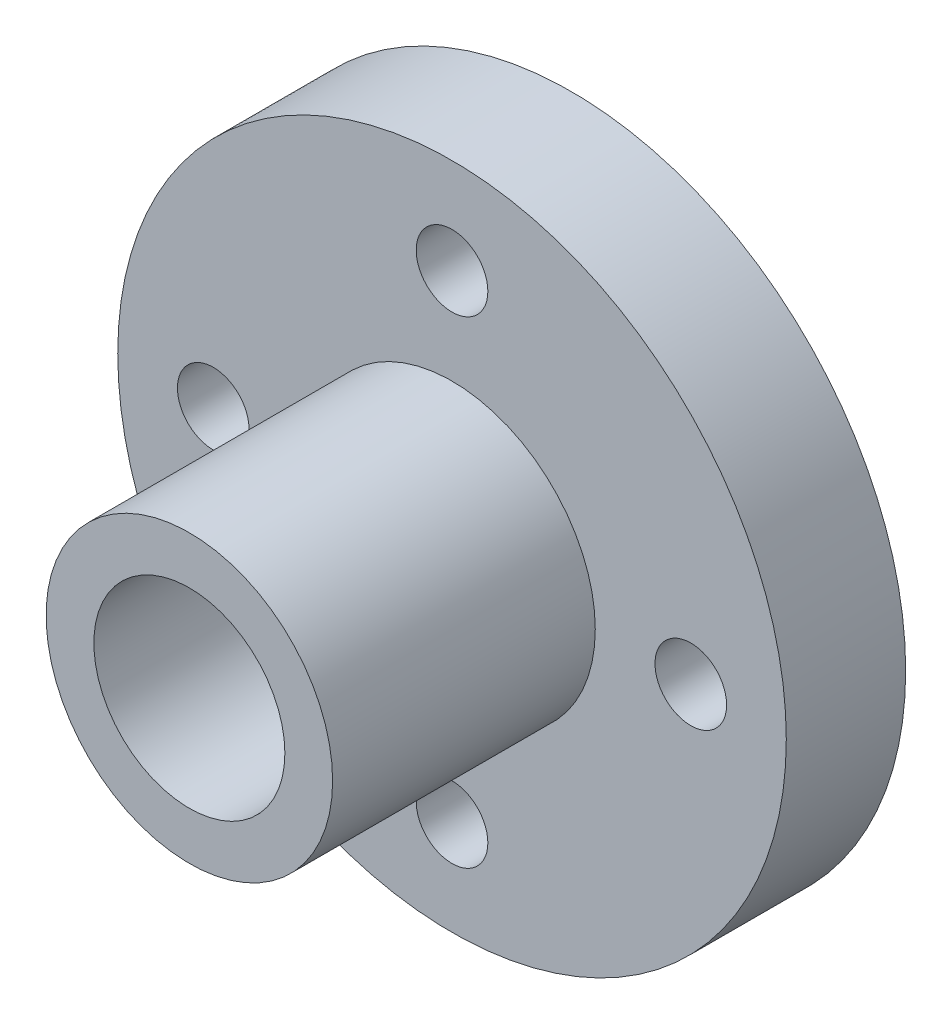
ISO-10303-21;
HEADER;
FILE_DESCRIPTION(('STEP AP214'),'2;1');
FILE_NAME('part.step','',(''),(''),'','','');
FILE_SCHEMA(('AUTOMOTIVE_DESIGN { 1 0 10303 214 1 1 1 1 }'));
ENDSEC;
DATA;
#1=APPLICATION_CONTEXT('core data for automotive mechanical design processes');
#2=APPLICATION_PROTOCOL_DEFINITION('international standard','automotive_design',2000,#1);
#3=PRODUCT_CONTEXT('',#1,'mechanical');
#4=PRODUCT('Part','Part','',(#3));
#5=PRODUCT_RELATED_PRODUCT_CATEGORY('part','',(#4));
#6=PRODUCT_DEFINITION_FORMATION('','',#4);
#7=PRODUCT_DEFINITION_CONTEXT('part definition',#1,'design');
#8=PRODUCT_DEFINITION('design','',#6,#7);
#9=PRODUCT_DEFINITION_SHAPE('','',#8);
#10=(LENGTH_UNIT() NAMED_UNIT(*) SI_UNIT(.MILLI.,.METRE.));
#11=(NAMED_UNIT(*) PLANE_ANGLE_UNIT() SI_UNIT($,.RADIAN.));
#12=(NAMED_UNIT(*) SI_UNIT($,.STERADIAN.) SOLID_ANGLE_UNIT());
#13=UNCERTAINTY_MEASURE_WITH_UNIT(LENGTH_MEASURE(1.E-05),#10,'distance_accuracy_value','');
#14=(GEOMETRIC_REPRESENTATION_CONTEXT(3) GLOBAL_UNCERTAINTY_ASSIGNED_CONTEXT((#13)) GLOBAL_UNIT_ASSIGNED_CONTEXT((#10,
#11,#12)) REPRESENTATION_CONTEXT('',''));
#15=CARTESIAN_POINT('',(0.,0.,0.));
#16=DIRECTION('',(0.,0.,1.));
#17=DIRECTION('',(1.,0.,0.));
#18=AXIS2_PLACEMENT_3D('',#15,#16,#17);
#19=CARTESIAN_POINT('',(0.,0.,5.));
#20=DIRECTION('',(0.,0.,1.));
#21=DIRECTION('',(1.,0.,0.));
#22=AXIS2_PLACEMENT_3D('',#19,#20,#21);
#23=PLANE('',#22);
#24=CARTESIAN_POINT('',(-10.,0.,5.));
#25=DIRECTION('',(0.,0.,1.));
#26=DIRECTION('',(1.,0.,0.));
#27=AXIS2_PLACEMENT_3D('',#24,#25,#26);
#28=CIRCLE('',#27,1.5);
#29=CARTESIAN_POINT('',(-8.5,0.,5.));
#30=VERTEX_POINT('',#29);
#31=EDGE_CURVE('E82',#30,#30,#28,.T.);
#32=ORIENTED_EDGE('',*,*,#31,.F.);
#33=EDGE_LOOP('',(#32));
#34=FACE_BOUND('',#33,.T.);
#35=CARTESIAN_POINT('',(10.,0.,5.));
#36=DIRECTION('',(0.,0.,1.));
#37=DIRECTION('',(1.,0.,0.));
#38=AXIS2_PLACEMENT_3D('',#35,#36,#37);
#39=CIRCLE('',#38,1.5);
#40=CARTESIAN_POINT('',(11.5,0.,5.));
#41=VERTEX_POINT('',#40);
#42=EDGE_CURVE('E66',#41,#41,#39,.T.);
#43=ORIENTED_EDGE('',*,*,#42,.F.);
#44=EDGE_LOOP('',(#43));
#45=FACE_BOUND('',#44,.T.);
#46=CARTESIAN_POINT('',(0.,0.,5.));
#47=DIRECTION('',(0.,0.,1.));
#48=DIRECTION('',(1.,0.,0.));
#49=AXIS2_PLACEMENT_3D('',#46,#47,#48);
#50=CIRCLE('',#49,14.);
#51=CARTESIAN_POINT('',(14.,0.,5.));
#52=VERTEX_POINT('',#51);
#53=EDGE_CURVE('E10',#52,#52,#50,.T.);
#54=ORIENTED_EDGE('',*,*,#53,.T.);
#55=EDGE_LOOP('',(#54));
#56=FACE_BOUND('',#55,.T.);
#57=CARTESIAN_POINT('',(0.,10.,5.));
#58=DIRECTION('',(0.,0.,1.));
#59=DIRECTION('',(1.,0.,0.));
#60=AXIS2_PLACEMENT_3D('',#57,#58,#59);
#61=CIRCLE('',#60,1.5);
#62=CARTESIAN_POINT('',(1.5,10.,5.));
#63=VERTEX_POINT('',#62);
#64=EDGE_CURVE('E61',#63,#63,#61,.T.);
#65=ORIENTED_EDGE('',*,*,#64,.F.);
#66=EDGE_LOOP('',(#65));
#67=FACE_BOUND('',#66,.T.);
#68=CARTESIAN_POINT('',(0.,-10.,5.));
#69=DIRECTION('',(0.,0.,1.));
#70=DIRECTION('',(1.,0.,0.));
#71=AXIS2_PLACEMENT_3D('',#68,#69,#70);
#72=CIRCLE('',#71,1.5);
#73=CARTESIAN_POINT('',(1.5,-10.,5.));
#74=VERTEX_POINT('',#73);
#75=EDGE_CURVE('E74',#74,#74,#72,.T.);
#76=ORIENTED_EDGE('',*,*,#75,.F.);
#77=EDGE_LOOP('',(#76));
#78=FACE_BOUND('',#77,.T.);
#79=CARTESIAN_POINT('',(0.,0.,5.));
#80=DIRECTION('',(0.,0.,1.));
#81=DIRECTION('',(1.,0.,0.));
#82=AXIS2_PLACEMENT_3D('',#79,#80,#81);
#83=CIRCLE('',#82,6.);
#84=CARTESIAN_POINT('',(6.,0.,5.));
#85=VERTEX_POINT('',#84);
#86=EDGE_CURVE('E94',#85,#85,#83,.T.);
#87=ORIENTED_EDGE('',*,*,#86,.F.);
#88=EDGE_LOOP('',(#87));
#89=FACE_BOUND('',#88,.T.);
#90=ADVANCED_FACE('F43',(#34,#45,#56,#67,#78,#89),#23,.T.);
#91=CARTESIAN_POINT('',(0.,0.,0.));
#92=DIRECTION('',(0.,0.,1.));
#93=DIRECTION('',(1.,0.,0.));
#94=AXIS2_PLACEMENT_3D('',#91,#92,#93);
#95=PLANE('',#94);
#96=CARTESIAN_POINT('',(0.,0.,0.));
#97=DIRECTION('',(0.,0.,1.));
#98=DIRECTION('',(1.,0.,0.));
#99=AXIS2_PLACEMENT_3D('',#96,#97,#98);
#100=CIRCLE('',#99,14.);
#101=CARTESIAN_POINT('',(14.,0.,0.));
#102=VERTEX_POINT('',#101);
#103=EDGE_CURVE('E47',#102,#102,#100,.T.);
#104=ORIENTED_EDGE('',*,*,#103,.F.);
#105=EDGE_LOOP('',(#104));
#106=FACE_BOUND('',#105,.T.);
#107=CARTESIAN_POINT('',(0.,0.,0.));
#108=DIRECTION('',(0.,0.,1.));
#109=DIRECTION('',(1.,0.,0.));
#110=AXIS2_PLACEMENT_3D('',#107,#108,#109);
#111=CIRCLE('',#110,4.);
#112=CARTESIAN_POINT('',(4.,0.,0.));
#113=VERTEX_POINT('',#112);
#114=EDGE_CURVE('E56',#113,#113,#111,.T.);
#115=ORIENTED_EDGE('',*,*,#114,.T.);
#116=EDGE_LOOP('',(#115));
#117=FACE_BOUND('',#116,.T.);
#118=CARTESIAN_POINT('',(0.,10.,0.));
#119=DIRECTION('',(0.,0.,1.));
#120=DIRECTION('',(1.,0.,0.));
#121=AXIS2_PLACEMENT_3D('',#118,#119,#120);
#122=CIRCLE('',#121,1.5);
#123=CARTESIAN_POINT('',(1.5,10.,0.));
#124=VERTEX_POINT('',#123);
#125=EDGE_CURVE('E62',#124,#124,#122,.T.);
#126=ORIENTED_EDGE('',*,*,#125,.T.);
#127=EDGE_LOOP('',(#126));
#128=FACE_BOUND('',#127,.T.);
#129=CARTESIAN_POINT('',(10.,0.,0.));
#130=DIRECTION('',(0.,0.,1.));
#131=DIRECTION('',(1.,0.,0.));
#132=AXIS2_PLACEMENT_3D('',#129,#130,#131);
#133=CIRCLE('',#132,1.5);
#134=CARTESIAN_POINT('',(11.5,0.,0.));
#135=VERTEX_POINT('',#134);
#136=EDGE_CURVE('E70',#135,#135,#133,.T.);
#137=ORIENTED_EDGE('',*,*,#136,.T.);
#138=EDGE_LOOP('',(#137));
#139=FACE_BOUND('',#138,.T.);
#140=CARTESIAN_POINT('',(0.,-10.,0.));
#141=DIRECTION('',(0.,0.,1.));
#142=DIRECTION('',(1.,0.,0.));
#143=AXIS2_PLACEMENT_3D('',#140,#141,#142);
#144=CIRCLE('',#143,1.5);
#145=CARTESIAN_POINT('',(1.5,-10.,0.));
#146=VERTEX_POINT('',#145);
#147=EDGE_CURVE('E78',#146,#146,#144,.T.);
#148=ORIENTED_EDGE('',*,*,#147,.T.);
#149=EDGE_LOOP('',(#148));
#150=FACE_BOUND('',#149,.T.);
#151=CARTESIAN_POINT('',(-10.,0.,0.));
#152=DIRECTION('',(0.,0.,1.));
#153=DIRECTION('',(1.,0.,0.));
#154=AXIS2_PLACEMENT_3D('',#151,#152,#153);
#155=CIRCLE('',#154,1.5);
#156=CARTESIAN_POINT('',(-8.5,0.,0.));
#157=VERTEX_POINT('',#156);
#158=EDGE_CURVE('E86',#157,#157,#155,.T.);
#159=ORIENTED_EDGE('',*,*,#158,.T.);
#160=EDGE_LOOP('',(#159));
#161=FACE_BOUND('',#160,.T.);
#162=ADVANCED_FACE('F125',(#106,#117,#128,#139,#150,#161),#95,.F.);
#163=CARTESIAN_POINT('',(0.,0.,5.));
#164=DIRECTION('',(0.,0.,-1.));
#165=DIRECTION('',(-1.,0.,0.));
#166=AXIS2_PLACEMENT_3D('',#163,#164,#165);
#167=CYLINDRICAL_SURFACE('',#166,14.);
#168=ORIENTED_EDGE('',*,*,#53,.F.);
#169=EDGE_LOOP('',(#168));
#170=FACE_BOUND('',#169,.T.);
#171=ORIENTED_EDGE('',*,*,#103,.T.);
#172=EDGE_LOOP('',(#171));
#173=FACE_BOUND('',#172,.T.);
#174=ADVANCED_FACE('F45',(#170,#173),#167,.T.);
#175=CARTESIAN_POINT('',(0.,0.,5.));
#176=DIRECTION('',(0.,0.,-1.));
#177=DIRECTION('',(-1.,0.,0.));
#178=AXIS2_PLACEMENT_3D('',#175,#176,#177);
#179=CYLINDRICAL_SURFACE('',#178,4.);
#180=ORIENTED_EDGE('',*,*,#114,.F.);
#181=EDGE_LOOP('',(#180));
#182=FACE_BOUND('',#181,.T.);
#183=CARTESIAN_POINT('',(0.,0.,16.));
#184=DIRECTION('',(0.,0.,1.));
#185=DIRECTION('',(1.,0.,0.));
#186=AXIS2_PLACEMENT_3D('',#183,#184,#185);
#187=CIRCLE('',#186,4.);
#188=CARTESIAN_POINT('',(4.,0.,16.));
#189=VERTEX_POINT('',#188);
#190=EDGE_CURVE('E98',#189,#189,#187,.T.);
#191=ORIENTED_EDGE('',*,*,#190,.T.);
#192=EDGE_LOOP('',(#191));
#193=FACE_BOUND('',#192,.T.);
#194=ADVANCED_FACE('F106',(#182,#193),#179,.F.);
#195=CARTESIAN_POINT('',(0.,10.,5.));
#196=DIRECTION('',(0.,0.,-1.));
#197=DIRECTION('',(-1.,0.,0.));
#198=AXIS2_PLACEMENT_3D('',#195,#196,#197);
#199=CYLINDRICAL_SURFACE('',#198,1.5);
#200=ORIENTED_EDGE('',*,*,#64,.T.);
#201=EDGE_LOOP('',(#200));
#202=FACE_BOUND('',#201,.T.);
#203=ORIENTED_EDGE('',*,*,#125,.F.);
#204=EDGE_LOOP('',(#203));
#205=FACE_BOUND('',#204,.T.);
#206=ADVANCED_FACE('F136',(#202,#205),#199,.F.);
#207=CARTESIAN_POINT('',(10.,0.,5.));
#208=DIRECTION('',(0.,0.,-1.));
#209=DIRECTION('',(-1.,0.,0.));
#210=AXIS2_PLACEMENT_3D('',#207,#208,#209);
#211=CYLINDRICAL_SURFACE('',#210,1.5);
#212=ORIENTED_EDGE('',*,*,#42,.T.);
#213=EDGE_LOOP('',(#212));
#214=FACE_BOUND('',#213,.T.);
#215=ORIENTED_EDGE('',*,*,#136,.F.);
#216=EDGE_LOOP('',(#215));
#217=FACE_BOUND('',#216,.T.);
#218=ADVANCED_FACE('F140',(#214,#217),#211,.F.);
#219=CARTESIAN_POINT('',(0.,-10.,5.));
#220=DIRECTION('',(0.,0.,-1.));
#221=DIRECTION('',(-1.,0.,0.));
#222=AXIS2_PLACEMENT_3D('',#219,#220,#221);
#223=CYLINDRICAL_SURFACE('',#222,1.5);
#224=ORIENTED_EDGE('',*,*,#75,.T.);
#225=EDGE_LOOP('',(#224));
#226=FACE_BOUND('',#225,.T.);
#227=ORIENTED_EDGE('',*,*,#147,.F.);
#228=EDGE_LOOP('',(#227));
#229=FACE_BOUND('',#228,.T.);
#230=ADVANCED_FACE('F121',(#226,#229),#223,.F.);
#231=CARTESIAN_POINT('',(-10.,0.,5.));
#232=DIRECTION('',(0.,0.,-1.));
#233=DIRECTION('',(-1.,0.,0.));
#234=AXIS2_PLACEMENT_3D('',#231,#232,#233);
#235=CYLINDRICAL_SURFACE('',#234,1.5);
#236=ORIENTED_EDGE('',*,*,#31,.T.);
#237=EDGE_LOOP('',(#236));
#238=FACE_BOUND('',#237,.T.);
#239=ORIENTED_EDGE('',*,*,#158,.F.);
#240=EDGE_LOOP('',(#239));
#241=FACE_BOUND('',#240,.T.);
#242=ADVANCED_FACE('F111',(#238,#241),#235,.F.);
#243=CARTESIAN_POINT('',(0.,0.,16.));
#244=DIRECTION('',(0.,0.,1.));
#245=DIRECTION('',(1.,0.,0.));
#246=AXIS2_PLACEMENT_3D('',#243,#244,#245);
#247=PLANE('',#246);
#248=CARTESIAN_POINT('',(0.,0.,16.));
#249=DIRECTION('',(0.,0.,1.));
#250=DIRECTION('',(1.,0.,0.));
#251=AXIS2_PLACEMENT_3D('',#248,#249,#250);
#252=CIRCLE('',#251,6.);
#253=CARTESIAN_POINT('',(6.,0.,16.));
#254=VERTEX_POINT('',#253);
#255=EDGE_CURVE('E90',#254,#254,#252,.T.);
#256=ORIENTED_EDGE('',*,*,#255,.T.);
#257=EDGE_LOOP('',(#256));
#258=FACE_BOUND('',#257,.T.);
#259=ORIENTED_EDGE('',*,*,#190,.F.);
#260=EDGE_LOOP('',(#259));
#261=FACE_BOUND('',#260,.T.);
#262=ADVANCED_FACE('F108',(#258,#261),#247,.T.);
#263=CARTESIAN_POINT('',(0.,0.,16.));
#264=DIRECTION('',(0.,0.,-1.));
#265=DIRECTION('',(-1.,0.,0.));
#266=AXIS2_PLACEMENT_3D('',#263,#264,#265);
#267=CYLINDRICAL_SURFACE('',#266,6.);
#268=ORIENTED_EDGE('',*,*,#255,.F.);
#269=EDGE_LOOP('',(#268));
#270=FACE_BOUND('',#269,.T.);
#271=ORIENTED_EDGE('',*,*,#86,.T.);
#272=EDGE_LOOP('',(#271));
#273=FACE_BOUND('',#272,.T.);
#274=ADVANCED_FACE('F110',(#270,#273),#267,.T.);
#275=CLOSED_SHELL('',(#90,#162,#174,#194,#206,#218,#230,#242,#262,#274));
#276=MANIFOLD_SOLID_BREP('B2',#275);
#277=ADVANCED_BREP_SHAPE_REPRESENTATION('',(#18,#276),#14);
#278=SHAPE_DEFINITION_REPRESENTATION(#9,#277);
ENDSEC;
END-ISO-10303-21;
